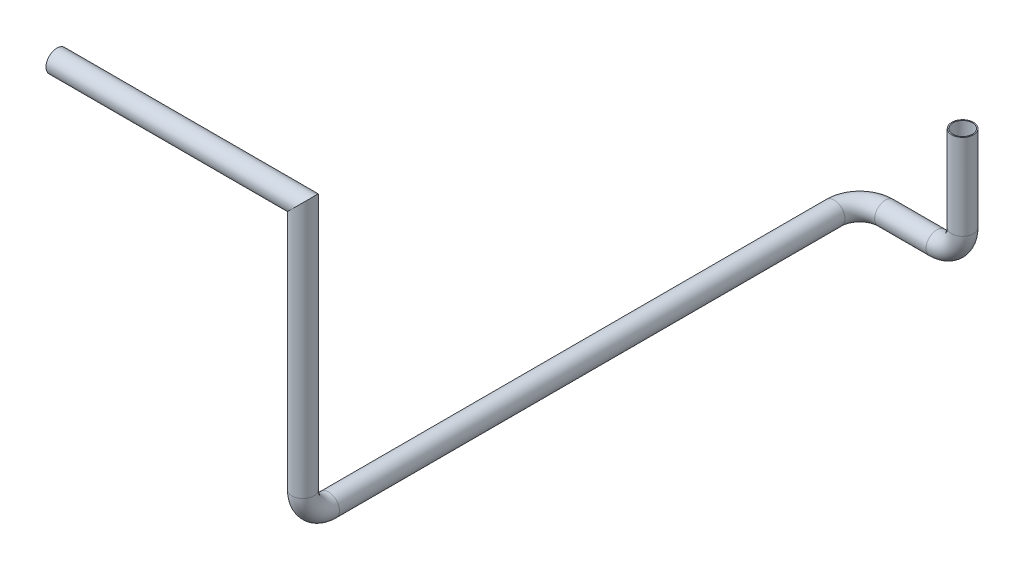
ISO-10303-21;
HEADER;
FILE_DESCRIPTION(('STEP AP214'),'2;1');
FILE_NAME('part.step','',(''),(''),'','','');
FILE_SCHEMA(('AUTOMOTIVE_DESIGN { 1 0 10303 214 1 1 1 1 }'));
ENDSEC;
DATA;
#1=APPLICATION_CONTEXT('core data for automotive mechanical design processes');
#2=APPLICATION_PROTOCOL_DEFINITION('international standard','automotive_design',2000,#1);
#3=PRODUCT_CONTEXT('',#1,'mechanical');
#4=PRODUCT('Part','Part','',(#3));
#5=PRODUCT_RELATED_PRODUCT_CATEGORY('part','',(#4));
#6=PRODUCT_DEFINITION_FORMATION('','',#4);
#7=PRODUCT_DEFINITION_CONTEXT('part definition',#1,'design');
#8=PRODUCT_DEFINITION('design','',#6,#7);
#9=PRODUCT_DEFINITION_SHAPE('','',#8);
#10=(LENGTH_UNIT() NAMED_UNIT(*) SI_UNIT(.MILLI.,.METRE.));
#11=(NAMED_UNIT(*) PLANE_ANGLE_UNIT() SI_UNIT($,.RADIAN.));
#12=(NAMED_UNIT(*) SI_UNIT($,.STERADIAN.) SOLID_ANGLE_UNIT());
#13=UNCERTAINTY_MEASURE_WITH_UNIT(LENGTH_MEASURE(1.E-05),#10,'distance_accuracy_value','');
#14=(GEOMETRIC_REPRESENTATION_CONTEXT(3) GLOBAL_UNCERTAINTY_ASSIGNED_CONTEXT((#13)) GLOBAL_UNIT_ASSIGNED_CONTEXT((#10,
#11,#12)) REPRESENTATION_CONTEXT('',''));
#15=CARTESIAN_POINT('',(0.,0.,0.));
#16=DIRECTION('',(0.,0.,1.));
#17=DIRECTION('',(1.,0.,0.));
#18=AXIS2_PLACEMENT_3D('',#15,#16,#17);
#19=CARTESIAN_POINT('',(0.,-10.,0.));
#20=DIRECTION('',(0.,1.,0.));
#21=DIRECTION('',(0.,0.,1.));
#22=AXIS2_PLACEMENT_3D('',#19,#20,#21);
#23=CYLINDRICAL_SURFACE('',#22,12.7);
#24=CARTESIAN_POINT('',(0.,0.,0.));
#25=DIRECTION('',(0.,1.,0.));
#26=DIRECTION('',(0.,0.,1.));
#27=AXIS2_PLACEMENT_3D('',#24,#25,#26);
#28=CIRCLE('',#27,12.7);
#29=CARTESIAN_POINT('',(0.,0.,12.7));
#30=VERTEX_POINT('',#29);
#31=EDGE_CURVE('E11',#30,#30,#28,.T.);
#32=ORIENTED_EDGE('',*,*,#31,.F.);
#33=EDGE_LOOP('',(#32));
#34=FACE_BOUND('',#33,.T.);
#35=CARTESIAN_POINT('',(0.,-100.,0.));
#36=DIRECTION('',(0.,-1.,0.));
#37=DIRECTION('',(0.,0.,-1.));
#38=AXIS2_PLACEMENT_3D('',#35,#36,#37);
#39=CIRCLE('',#38,12.7);
#40=CARTESIAN_POINT('',(12.7,-100.,0.));
#41=VERTEX_POINT('',#40);
#42=EDGE_CURVE('E88',#41,#41,#39,.T.);
#43=ORIENTED_EDGE('',*,*,#42,.F.);
#44=EDGE_LOOP('',(#43));
#45=FACE_BOUND('',#44,.T.);
#46=ADVANCED_FACE('F35',(#34,#45),#23,.T.);
#47=CARTESIAN_POINT('',(0.,0.,0.));
#48=DIRECTION('',(0.,1.,0.));
#49=DIRECTION('',(0.,0.,1.));
#50=AXIS2_PLACEMENT_3D('',#47,#48,#49);
#51=PLANE('',#50);
#52=CARTESIAN_POINT('',(0.,0.,0.));
#53=DIRECTION('',(0.,1.,0.));
#54=DIRECTION('',(0.,0.,1.));
#55=AXIS2_PLACEMENT_3D('',#52,#53,#54);
#56=CIRCLE('',#55,11.5);
#57=CARTESIAN_POINT('',(0.,0.,11.5));
#58=VERTEX_POINT('',#57);
#59=EDGE_CURVE('E41',#58,#58,#56,.T.);
#60=ORIENTED_EDGE('',*,*,#59,.F.);
#61=EDGE_LOOP('',(#60));
#62=FACE_BOUND('',#61,.T.);
#63=ORIENTED_EDGE('',*,*,#31,.T.);
#64=EDGE_LOOP('',(#63));
#65=FACE_BOUND('',#64,.T.);
#66=ADVANCED_FACE('F117',(#62,#65),#51,.T.);
#67=CARTESIAN_POINT('',(0.,-10.,0.));
#68=DIRECTION('',(0.,1.,0.));
#69=DIRECTION('',(0.,0.,1.));
#70=AXIS2_PLACEMENT_3D('',#67,#68,#69);
#71=CYLINDRICAL_SURFACE('',#70,11.5);
#72=ORIENTED_EDGE('',*,*,#59,.T.);
#73=EDGE_LOOP('',(#72));
#74=FACE_BOUND('',#73,.T.);
#75=CARTESIAN_POINT('',(0.,-100.,0.));
#76=DIRECTION('',(0.,-1.,0.));
#77=DIRECTION('',(0.,0.,-1.));
#78=AXIS2_PLACEMENT_3D('',#75,#76,#77);
#79=CIRCLE('',#78,11.5);
#80=CARTESIAN_POINT('',(11.5,-100.,0.));
#81=VERTEX_POINT('',#80);
#82=EDGE_CURVE('E91',#81,#81,#79,.T.);
#83=ORIENTED_EDGE('',*,*,#82,.T.);
#84=EDGE_LOOP('',(#83));
#85=FACE_BOUND('',#84,.T.);
#86=ADVANCED_FACE('F122',(#74,#85),#71,.F.);
#87=CARTESIAN_POINT('',(-120.,190.,650.));
#88=DIRECTION('',(-1.,0.,0.));
#89=DIRECTION('',(0.,-1.,0.));
#90=AXIS2_PLACEMENT_3D('',#87,#88,#89);
#91=CYLINDRICAL_SURFACE('',#90,12.7);
#92=CARTESIAN_POINT('',(-120.,190.,650.));
#93=DIRECTION('',(-0.707106781186548,0.707106781186547,0.));
#94=DIRECTION('',(0.707106781186547,0.707106781186548,0.));
#95=AXIS2_PLACEMENT_3D('',#92,#93,#94);
#96=ELLIPSE('',#95,17.9605122421383,12.7);
#97=CARTESIAN_POINT('',(-107.3,202.7,650.));
#98=VERTEX_POINT('',#97);
#99=EDGE_CURVE('E55',#98,#98,#96,.F.);
#100=ORIENTED_EDGE('',*,*,#99,.F.);
#101=EDGE_LOOP('',(#100));
#102=FACE_BOUND('',#101,.T.);
#103=CARTESIAN_POINT('',(-407.113824639765,190.,650.));
#104=DIRECTION('',(-1.,0.,0.));
#105=DIRECTION('',(0.,-1.,0.));
#106=AXIS2_PLACEMENT_3D('',#103,#104,#105);
#107=CIRCLE('',#106,12.7);
#108=CARTESIAN_POINT('',(-407.113824639765,177.3,650.));
#109=VERTEX_POINT('',#108);
#110=EDGE_CURVE('E45',#109,#109,#107,.T.);
#111=ORIENTED_EDGE('',*,*,#110,.F.);
#112=EDGE_LOOP('',(#111));
#113=FACE_BOUND('',#112,.T.);
#114=ADVANCED_FACE('F112',(#102,#113),#91,.T.);
#115=CARTESIAN_POINT('',(-120.,190.,650.));
#116=DIRECTION('',(-1.,0.,0.));
#117=DIRECTION('',(0.,-1.,0.));
#118=AXIS2_PLACEMENT_3D('',#115,#116,#117);
#119=CYLINDRICAL_SURFACE('',#118,11.5);
#120=CARTESIAN_POINT('',(-120.,190.,650.));
#121=DIRECTION('',(-0.707106781186548,0.707106781186547,0.));
#122=DIRECTION('',(0.707106781186547,0.707106781186548,0.));
#123=AXIS2_PLACEMENT_3D('',#120,#121,#122);
#124=ELLIPSE('',#123,16.2634559672906,11.5);
#125=CARTESIAN_POINT('',(-108.5,201.5,650.));
#126=VERTEX_POINT('',#125);
#127=EDGE_CURVE('E54',#126,#126,#124,.F.);
#128=ORIENTED_EDGE('',*,*,#127,.T.);
#129=EDGE_LOOP('',(#128));
#130=FACE_BOUND('',#129,.T.);
#131=CARTESIAN_POINT('',(-407.113824639765,190.,650.));
#132=DIRECTION('',(-1.,0.,0.));
#133=DIRECTION('',(0.,-1.,0.));
#134=AXIS2_PLACEMENT_3D('',#131,#132,#133);
#135=CIRCLE('',#134,11.5);
#136=CARTESIAN_POINT('',(-407.113824639765,178.5,650.));
#137=VERTEX_POINT('',#136);
#138=EDGE_CURVE('E49',#137,#137,#135,.T.);
#139=ORIENTED_EDGE('',*,*,#138,.T.);
#140=EDGE_LOOP('',(#139));
#141=FACE_BOUND('',#140,.T.);
#142=ADVANCED_FACE('F97',(#130,#141),#119,.F.);
#143=CARTESIAN_POINT('',(-120.,-100.,650.));
#144=DIRECTION('',(0.,1.,0.));
#145=DIRECTION('',(0.,0.,1.));
#146=AXIS2_PLACEMENT_3D('',#143,#144,#145);
#147=CYLINDRICAL_SURFACE('',#146,11.5);
#148=CARTESIAN_POINT('',(-120.,-100.,650.));
#149=DIRECTION('',(0.,1.,0.));
#150=DIRECTION('',(-1.,0.,0.));
#151=AXIS2_PLACEMENT_3D('',#148,#149,#150);
#152=CIRCLE('',#151,11.5);
#153=CARTESIAN_POINT('',(-120.,-100.,661.5));
#154=VERTEX_POINT('',#153);
#155=EDGE_CURVE('E61',#154,#154,#152,.T.);
#156=ORIENTED_EDGE('',*,*,#155,.F.);
#157=EDGE_LOOP('',(#156));
#158=FACE_BOUND('',#157,.T.);
#159=ORIENTED_EDGE('',*,*,#127,.F.);
#160=EDGE_LOOP('',(#159));
#161=FACE_BOUND('',#160,.T.);
#162=ADVANCED_FACE('F100',(#158,#161),#147,.F.);
#163=CARTESIAN_POINT('',(-120.,-100.,650.));
#164=DIRECTION('',(0.,1.,0.));
#165=DIRECTION('',(0.,0.,1.));
#166=AXIS2_PLACEMENT_3D('',#163,#164,#165);
#167=CYLINDRICAL_SURFACE('',#166,12.7);
#168=CARTESIAN_POINT('',(-120.,-100.,650.));
#169=DIRECTION('',(0.,1.,0.));
#170=DIRECTION('',(-1.,0.,0.));
#171=AXIS2_PLACEMENT_3D('',#168,#169,#170);
#172=CIRCLE('',#171,12.7);
#173=CARTESIAN_POINT('',(-120.,-100.,662.7));
#174=VERTEX_POINT('',#173);
#175=EDGE_CURVE('E58',#174,#174,#172,.T.);
#176=ORIENTED_EDGE('',*,*,#175,.T.);
#177=EDGE_LOOP('',(#176));
#178=FACE_BOUND('',#177,.T.);
#179=ORIENTED_EDGE('',*,*,#99,.T.);
#180=EDGE_LOOP('',(#179));
#181=FACE_BOUND('',#180,.T.);
#182=ADVANCED_FACE('F102',(#178,#181),#167,.T.);
#183=CARTESIAN_POINT('',(-120.,-100.,620.));
#184=DIRECTION('',(-1.,0.,0.));
#185=DIRECTION('',(0.,0.,1.));
#186=AXIS2_PLACEMENT_3D('',#183,#184,#185);
#187=TOROIDAL_SURFACE('',#186,30.,12.7);
#188=CARTESIAN_POINT('',(-120.,-130.,620.));
#189=DIRECTION('',(0.,0.,1.));
#190=DIRECTION('',(-1.,0.,0.));
#191=AXIS2_PLACEMENT_3D('',#188,#189,#190);
#192=CIRCLE('',#191,12.7);
#193=CARTESIAN_POINT('',(-120.,-142.7,620.));
#194=VERTEX_POINT('',#193);
#195=EDGE_CURVE('E64',#194,#194,#192,.T.);
#196=CARTESIAN_POINT('',(-120.,-100.,620.));
#197=DIRECTION('',(-1.,0.,0.));
#198=DIRECTION('',(0.,0.,1.));
#199=AXIS2_PLACEMENT_3D('',#196,#197,#198);
#200=CIRCLE('',#199,42.7);
#201=EDGE_CURVE('',#194,#174,#200,.T.);
#202=ORIENTED_EDGE('',*,*,#195,.T.);
#203=ORIENTED_EDGE('',*,*,#175,.F.);
#204=ORIENTED_EDGE('',*,*,#201,.T.);
#205=ORIENTED_EDGE('',*,*,#201,.F.);
#206=EDGE_LOOP('',(#202,#204,#203,#205));
#207=FACE_BOUND('',#206,.T.);
#208=ADVANCED_FACE('F109',(#207),#187,.T.);
#209=CARTESIAN_POINT('',(-120.,-100.,620.));
#210=DIRECTION('',(-1.,0.,0.));
#211=DIRECTION('',(0.,0.,1.));
#212=AXIS2_PLACEMENT_3D('',#209,#210,#211);
#213=TOROIDAL_SURFACE('',#212,30.,11.5);
#214=CARTESIAN_POINT('',(-120.,-130.,620.));
#215=DIRECTION('',(0.,0.,1.));
#216=DIRECTION('',(-1.,0.,0.));
#217=AXIS2_PLACEMENT_3D('',#214,#215,#216);
#218=CIRCLE('',#217,11.5);
#219=CARTESIAN_POINT('',(-120.,-141.5,620.));
#220=VERTEX_POINT('',#219);
#221=EDGE_CURVE('E67',#220,#220,#218,.T.);
#222=CARTESIAN_POINT('',(-120.,-100.,620.));
#223=DIRECTION('',(-1.,0.,0.));
#224=DIRECTION('',(0.,0.,1.));
#225=AXIS2_PLACEMENT_3D('',#222,#223,#224);
#226=CIRCLE('',#225,41.5);
#227=EDGE_CURVE('',#220,#154,#226,.T.);
#228=ORIENTED_EDGE('',*,*,#221,.F.);
#229=ORIENTED_EDGE('',*,*,#155,.T.);
#230=ORIENTED_EDGE('',*,*,#227,.T.);
#231=ORIENTED_EDGE('',*,*,#227,.F.);
#232=EDGE_LOOP('',(#228,#230,#229,#231));
#233=FACE_BOUND('',#232,.T.);
#234=ADVANCED_FACE('F152',(#233),#213,.F.);
#235=CARTESIAN_POINT('',(-120.,-130.,30.));
#236=DIRECTION('',(0.,0.,1.));
#237=DIRECTION('',(1.,0.,0.));
#238=AXIS2_PLACEMENT_3D('',#235,#236,#237);
#239=CYLINDRICAL_SURFACE('',#238,12.7);
#240=CARTESIAN_POINT('',(-120.,-130.,30.));
#241=DIRECTION('',(0.,0.,1.));
#242=DIRECTION('',(-1.,0.,0.));
#243=AXIS2_PLACEMENT_3D('',#240,#241,#242);
#244=CIRCLE('',#243,12.7);
#245=CARTESIAN_POINT('',(-132.7,-130.,30.));
#246=VERTEX_POINT('',#245);
#247=EDGE_CURVE('E70',#246,#246,#244,.T.);
#248=ORIENTED_EDGE('',*,*,#247,.T.);
#249=EDGE_LOOP('',(#248));
#250=FACE_BOUND('',#249,.T.);
#251=ORIENTED_EDGE('',*,*,#195,.F.);
#252=EDGE_LOOP('',(#251));
#253=FACE_BOUND('',#252,.T.);
#254=ADVANCED_FACE('F149',(#250,#253),#239,.T.);
#255=CARTESIAN_POINT('',(-120.,-130.,30.));
#256=DIRECTION('',(0.,0.,1.));
#257=DIRECTION('',(1.,0.,0.));
#258=AXIS2_PLACEMENT_3D('',#255,#256,#257);
#259=CYLINDRICAL_SURFACE('',#258,11.5);
#260=CARTESIAN_POINT('',(-120.,-130.,30.));
#261=DIRECTION('',(0.,0.,1.));
#262=DIRECTION('',(-1.,0.,0.));
#263=AXIS2_PLACEMENT_3D('',#260,#261,#262);
#264=CIRCLE('',#263,11.5);
#265=CARTESIAN_POINT('',(-131.5,-130.,30.));
#266=VERTEX_POINT('',#265);
#267=EDGE_CURVE('E73',#266,#266,#264,.T.);
#268=ORIENTED_EDGE('',*,*,#267,.F.);
#269=EDGE_LOOP('',(#268));
#270=FACE_BOUND('',#269,.T.);
#271=ORIENTED_EDGE('',*,*,#221,.T.);
#272=EDGE_LOOP('',(#271));
#273=FACE_BOUND('',#272,.T.);
#274=ADVANCED_FACE('F145',(#270,#273),#259,.F.);
#275=CARTESIAN_POINT('',(-90.,-130.,30.));
#276=DIRECTION('',(0.,1.,0.));
#277=DIRECTION('',(0.,0.,1.));
#278=AXIS2_PLACEMENT_3D('',#275,#276,#277);
#279=TOROIDAL_SURFACE('',#278,30.,12.7);
#280=CARTESIAN_POINT('',(-90.,-130.,0.));
#281=DIRECTION('',(-1.,0.,0.));
#282=DIRECTION('',(0.,0.,-1.));
#283=AXIS2_PLACEMENT_3D('',#280,#281,#282);
#284=CIRCLE('',#283,12.7);
#285=CARTESIAN_POINT('',(-90.,-130.,-12.7));
#286=VERTEX_POINT('',#285);
#287=EDGE_CURVE('E76',#286,#286,#284,.T.);
#288=CARTESIAN_POINT('',(-90.,-130.,30.));
#289=DIRECTION('',(0.,1.,0.));
#290=DIRECTION('',(0.,0.,1.));
#291=AXIS2_PLACEMENT_3D('',#288,#289,#290);
#292=CIRCLE('',#291,42.7);
#293=EDGE_CURVE('',#286,#246,#292,.T.);
#294=ORIENTED_EDGE('',*,*,#287,.T.);
#295=ORIENTED_EDGE('',*,*,#247,.F.);
#296=ORIENTED_EDGE('',*,*,#293,.T.);
#297=ORIENTED_EDGE('',*,*,#293,.F.);
#298=EDGE_LOOP('',(#294,#296,#295,#297));
#299=FACE_BOUND('',#298,.T.);
#300=ADVANCED_FACE('F142',(#299),#279,.T.);
#301=CARTESIAN_POINT('',(-90.,-130.,30.));
#302=DIRECTION('',(0.,1.,0.));
#303=DIRECTION('',(0.,0.,1.));
#304=AXIS2_PLACEMENT_3D('',#301,#302,#303);
#305=TOROIDAL_SURFACE('',#304,30.,11.5);
#306=CARTESIAN_POINT('',(-90.,-130.,0.));
#307=DIRECTION('',(-1.,0.,0.));
#308=DIRECTION('',(0.,0.,-1.));
#309=AXIS2_PLACEMENT_3D('',#306,#307,#308);
#310=CIRCLE('',#309,11.5);
#311=CARTESIAN_POINT('',(-90.,-130.,-11.5));
#312=VERTEX_POINT('',#311);
#313=EDGE_CURVE('E79',#312,#312,#310,.T.);
#314=CARTESIAN_POINT('',(-90.,-130.,30.));
#315=DIRECTION('',(0.,1.,0.));
#316=DIRECTION('',(0.,0.,1.));
#317=AXIS2_PLACEMENT_3D('',#314,#315,#316);
#318=CIRCLE('',#317,41.5);
#319=EDGE_CURVE('',#312,#266,#318,.T.);
#320=ORIENTED_EDGE('',*,*,#313,.F.);
#321=ORIENTED_EDGE('',*,*,#267,.T.);
#322=ORIENTED_EDGE('',*,*,#319,.T.);
#323=ORIENTED_EDGE('',*,*,#319,.F.);
#324=EDGE_LOOP('',(#320,#322,#321,#323));
#325=FACE_BOUND('',#324,.T.);
#326=ADVANCED_FACE('F138',(#325),#305,.F.);
#327=CARTESIAN_POINT('',(-30.,-130.,0.));
#328=DIRECTION('',(-1.,0.,0.));
#329=DIRECTION('',(0.,0.,1.));
#330=AXIS2_PLACEMENT_3D('',#327,#328,#329);
#331=CYLINDRICAL_SURFACE('',#330,12.7);
#332=CARTESIAN_POINT('',(-30.,-130.,0.));
#333=DIRECTION('',(-1.,0.,0.));
#334=DIRECTION('',(0.,0.,-1.));
#335=AXIS2_PLACEMENT_3D('',#332,#333,#334);
#336=CIRCLE('',#335,12.7);
#337=CARTESIAN_POINT('',(-30.,-142.7,0.));
#338=VERTEX_POINT('',#337);
#339=EDGE_CURVE('E82',#338,#338,#336,.T.);
#340=ORIENTED_EDGE('',*,*,#339,.T.);
#341=EDGE_LOOP('',(#340));
#342=FACE_BOUND('',#341,.T.);
#343=ORIENTED_EDGE('',*,*,#287,.F.);
#344=EDGE_LOOP('',(#343));
#345=FACE_BOUND('',#344,.T.);
#346=ADVANCED_FACE('F135',(#342,#345),#331,.T.);
#347=CARTESIAN_POINT('',(-30.,-130.,0.));
#348=DIRECTION('',(-1.,0.,0.));
#349=DIRECTION('',(0.,0.,1.));
#350=AXIS2_PLACEMENT_3D('',#347,#348,#349);
#351=CYLINDRICAL_SURFACE('',#350,11.5);
#352=CARTESIAN_POINT('',(-30.,-130.,0.));
#353=DIRECTION('',(-1.,0.,0.));
#354=DIRECTION('',(0.,0.,-1.));
#355=AXIS2_PLACEMENT_3D('',#352,#353,#354);
#356=CIRCLE('',#355,11.5);
#357=CARTESIAN_POINT('',(-30.,-141.5,0.));
#358=VERTEX_POINT('',#357);
#359=EDGE_CURVE('E85',#358,#358,#356,.T.);
#360=ORIENTED_EDGE('',*,*,#359,.F.);
#361=EDGE_LOOP('',(#360));
#362=FACE_BOUND('',#361,.T.);
#363=ORIENTED_EDGE('',*,*,#313,.T.);
#364=EDGE_LOOP('',(#363));
#365=FACE_BOUND('',#364,.T.);
#366=ADVANCED_FACE('F131',(#362,#365),#351,.F.);
#367=CARTESIAN_POINT('',(-30.,-100.,0.));
#368=DIRECTION('',(0.,0.,-1.));
#369=DIRECTION('',(-1.,0.,0.));
#370=AXIS2_PLACEMENT_3D('',#367,#368,#369);
#371=TOROIDAL_SURFACE('',#370,30.,12.7);
#372=CARTESIAN_POINT('',(-30.,-100.,0.));
#373=DIRECTION('',(0.,0.,-1.));
#374=DIRECTION('',(-1.,0.,0.));
#375=AXIS2_PLACEMENT_3D('',#372,#373,#374);
#376=CIRCLE('',#375,42.7);
#377=EDGE_CURVE('',#41,#338,#376,.T.);
#378=ORIENTED_EDGE('',*,*,#42,.T.);
#379=ORIENTED_EDGE('',*,*,#339,.F.);
#380=ORIENTED_EDGE('',*,*,#377,.T.);
#381=ORIENTED_EDGE('',*,*,#377,.F.);
#382=EDGE_LOOP('',(#378,#380,#379,#381));
#383=FACE_BOUND('',#382,.T.);
#384=ADVANCED_FACE('F127',(#383),#371,.T.);
#385=CARTESIAN_POINT('',(-30.,-100.,0.));
#386=DIRECTION('',(0.,0.,-1.));
#387=DIRECTION('',(-1.,0.,0.));
#388=AXIS2_PLACEMENT_3D('',#385,#386,#387);
#389=TOROIDAL_SURFACE('',#388,30.,11.5);
#390=CARTESIAN_POINT('',(-30.,-100.,0.));
#391=DIRECTION('',(0.,0.,-1.));
#392=DIRECTION('',(-1.,0.,0.));
#393=AXIS2_PLACEMENT_3D('',#390,#391,#392);
#394=CIRCLE('',#393,41.5);
#395=EDGE_CURVE('',#81,#358,#394,.T.);
#396=ORIENTED_EDGE('',*,*,#82,.F.);
#397=ORIENTED_EDGE('',*,*,#359,.T.);
#398=ORIENTED_EDGE('',*,*,#395,.T.);
#399=ORIENTED_EDGE('',*,*,#395,.F.);
#400=EDGE_LOOP('',(#396,#398,#397,#399));
#401=FACE_BOUND('',#400,.T.);
#402=ADVANCED_FACE('F130',(#401),#389,.F.);
#403=CARTESIAN_POINT('',(-407.113824639765,190.,650.));
#404=DIRECTION('',(-1.,0.,0.));
#405=DIRECTION('',(0.,-1.,0.));
#406=AXIS2_PLACEMENT_3D('',#403,#404,#405);
#407=PLANE('',#406);
#408=ORIENTED_EDGE('',*,*,#138,.F.);
#409=EDGE_LOOP('',(#408));
#410=FACE_BOUND('',#409,.T.);
#411=ORIENTED_EDGE('',*,*,#110,.T.);
#412=EDGE_LOOP('',(#411));
#413=FACE_BOUND('',#412,.T.);
#414=ADVANCED_FACE('F167',(#410,#413),#407,.T.);
#415=CLOSED_SHELL('',(#46,#66,#86,#114,#142,#162,#182,#208,#234,#254,#274,#300,#326,#346,#366,
#384,#402,#414));
#416=MANIFOLD_SOLID_BREP('B2',#415);
#417=ADVANCED_BREP_SHAPE_REPRESENTATION('',(#18,#416),#14);
#418=SHAPE_DEFINITION_REPRESENTATION(#9,#417);
ENDSEC;
END-ISO-10303-21;
